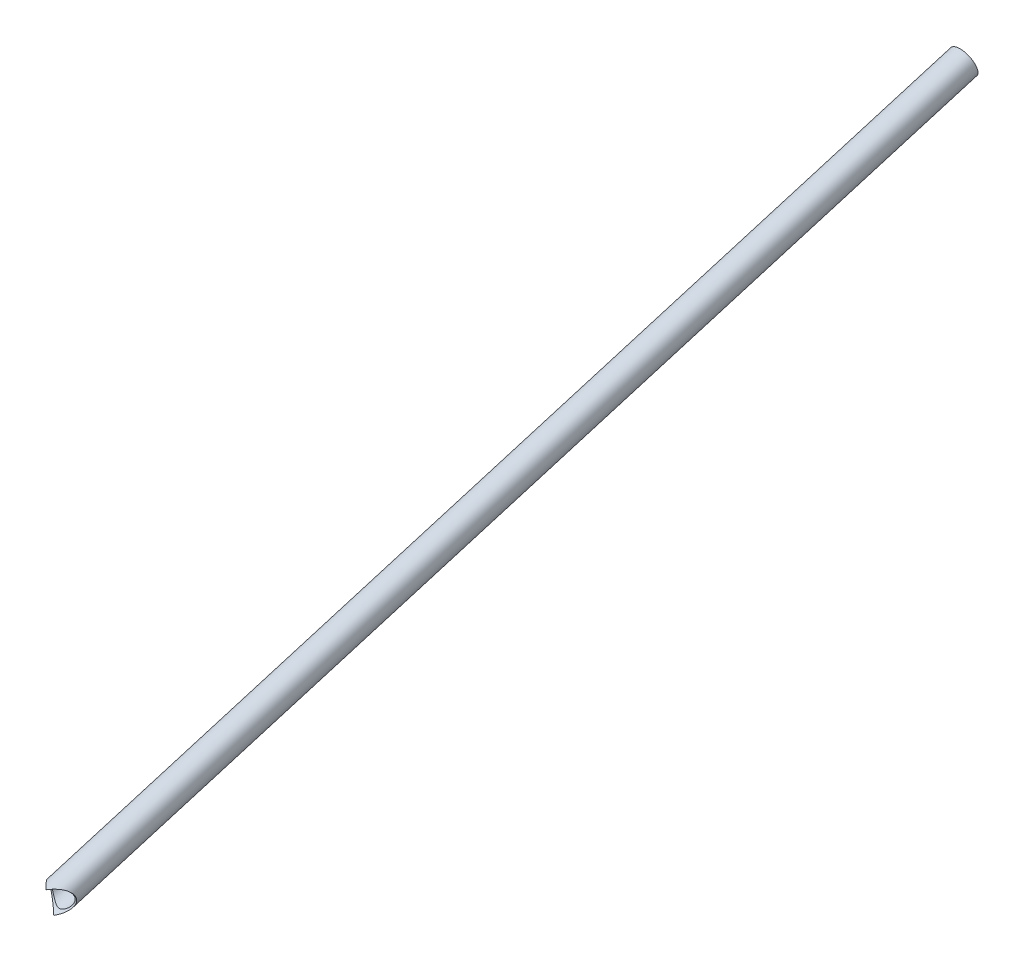
ISO-10303-21;
HEADER;
FILE_DESCRIPTION(('STEP AP214'),'2;1');
FILE_NAME('part.step','',(''),(''),'','','');
FILE_SCHEMA(('AUTOMOTIVE_DESIGN { 1 0 10303 214 1 1 1 1 }'));
ENDSEC;
DATA;
#1=APPLICATION_CONTEXT('core data for automotive mechanical design processes');
#2=APPLICATION_PROTOCOL_DEFINITION('international standard','automotive_design',2000,#1);
#3=PRODUCT_CONTEXT('',#1,'mechanical');
#4=PRODUCT('Part','Part','',(#3));
#5=PRODUCT_RELATED_PRODUCT_CATEGORY('part','',(#4));
#6=PRODUCT_DEFINITION_FORMATION('','',#4);
#7=PRODUCT_DEFINITION_CONTEXT('part definition',#1,'design');
#8=PRODUCT_DEFINITION('design','',#6,#7);
#9=PRODUCT_DEFINITION_SHAPE('','',#8);
#10=(LENGTH_UNIT() NAMED_UNIT(*) SI_UNIT(.MILLI.,.METRE.));
#11=(NAMED_UNIT(*) PLANE_ANGLE_UNIT() SI_UNIT($,.RADIAN.));
#12=(NAMED_UNIT(*) SI_UNIT($,.STERADIAN.) SOLID_ANGLE_UNIT());
#13=UNCERTAINTY_MEASURE_WITH_UNIT(LENGTH_MEASURE(1.E-05),#10,'distance_accuracy_value','');
#14=(GEOMETRIC_REPRESENTATION_CONTEXT(3) GLOBAL_UNCERTAINTY_ASSIGNED_CONTEXT((#13)) GLOBAL_UNIT_ASSIGNED_CONTEXT((#10,
#11,#12)) REPRESENTATION_CONTEXT('',''));
#15=CARTESIAN_POINT('',(0.,0.,0.));
#16=DIRECTION('',(0.,0.,1.));
#17=DIRECTION('',(1.,0.,0.));
#18=AXIS2_PLACEMENT_3D('',#15,#16,#17);
#19=CARTESIAN_POINT('',(0.,380.,-601.037933611912));
#20=DIRECTION('',(0.,0.28459115578957,-0.958648983750756));
#21=DIRECTION('',(0.,0.958648983750756,0.28459115578957));
#22=AXIS2_PLACEMENT_3D('',#19,#20,#21);
#23=CYLINDRICAL_SURFACE('',#22,7.1);
#24=CARTESIAN_POINT('',(0.,540.,-1140.));
#25=DIRECTION('',(0.,-0.28459115578957,0.958648983750756));
#26=DIRECTION('',(1.,0.,0.));
#27=AXIS2_PLACEMENT_3D('',#24,#25,#26);
#28=CIRCLE('',#27,7.1);
#29=CARTESIAN_POINT('',(7.10000000000003,540.,-1140.));
#30=VERTEX_POINT('',#29);
#31=EDGE_CURVE('E80',#30,#30,#28,.T.);
#32=ORIENTED_EDGE('',*,*,#31,.F.);
#33=EDGE_LOOP('',(#32));
#34=FACE_BOUND('',#33,.T.);
#35=CARTESIAN_POINT('',(0.,387.855542185796,-602.551359185627));
#36=CARTESIAN_POINT('',(-0.110485620792703,387.855542317616,-602.551342715054));
#37=CARTESIAN_POINT('',(-0.220930181131704,387.854484044348,-602.556880471244));
#38=CARTESIAN_POINT('',(-0.440730317581879,387.850246816259,-602.578631936881));
#39=CARTESIAN_POINT('',(-0.550085636184376,387.847067371506,-602.594848112741));
#40=CARTESIAN_POINT('',(-0.875646673448135,387.834286031328,-602.658385555484));
#41=CARTESIAN_POINT('',(-1.08890094621369,387.821440927512,-602.720590203443));
#42=CARTESIAN_POINT('',(-1.44749970977954,387.79147344696,-602.853475831368));
#43=CARTESIAN_POINT('',(-1.59570708238279,387.776424810418,-602.917399216428));
#44=CARTESIAN_POINT('',(-1.88591232098944,387.741330075925,-603.057093832454));
#45=CARTESIAN_POINT('',(-2.02790629122461,387.721280893975,-603.132872364084));
#46=CARTESIAN_POINT('',(-2.3063215746265,387.675895040551,-603.293509000797));
#47=CARTESIAN_POINT('',(-2.44272361123104,387.65054166234,-603.378395371336));
#48=CARTESIAN_POINT('',(-2.70995502785382,387.594348032313,-603.554769269548));
#49=CARTESIAN_POINT('',(-2.84078498422572,387.563508349693,-603.646256111845));
#50=CARTESIAN_POINT('',(-3.18030693594183,387.474277621893,-603.894874267166));
#51=CARTESIAN_POINT('',(-3.38465138088185,387.410964899638,-604.056204737491));
#52=CARTESIAN_POINT('',(-3.7807827612832,387.267583508657,-604.386782457685));
#53=CARTESIAN_POINT('',(-3.97256228406376,387.187505063793,-604.556034281609));
#54=CARTESIAN_POINT('',(-4.34355894800123,387.009535293983,-604.898453755151));
#55=CARTESIAN_POINT('',(-4.52278974960601,386.911663769586,-605.071616866463));
#56=CARTESIAN_POINT('',(-4.86836353818391,386.696917445559,-605.418911213122));
#57=CARTESIAN_POINT('',(-5.03471257312354,386.580051644556,-605.593041952505));
#58=CARTESIAN_POINT('',(-5.31565195123031,386.356266494638,-605.898463766426));
#59=CARTESIAN_POINT('',(-5.43317401386821,386.253539680852,-606.0301396551));
#60=CARTESIAN_POINT('',(-5.65930806686738,386.035898061858,-606.291200713811));
#61=CARTESIAN_POINT('',(-5.76791739975328,385.920979644774,-606.420585191675));
#62=CARTESIAN_POINT('',(-5.97505037371904,385.678832956545,-606.67546114425));
#63=CARTESIAN_POINT('',(-6.07358720637346,385.5516212218,-606.80095755682));
#64=CARTESIAN_POINT('',(-6.25951346138325,385.284693657772,-607.046667389016));
#65=CARTESIAN_POINT('',(-6.34691008740946,385.144986009306,-607.166884189327));
#66=CARTESIAN_POINT('',(-6.49376430822458,384.881079001717,-607.378116677627));
#67=CARTESIAN_POINT('',(-6.55536881124843,384.759022071887,-607.470320684725));
#68=CARTESIAN_POINT('',(-6.66970829112585,384.507090030579,-607.649287050107));
#69=CARTESIAN_POINT('',(-6.72244760458883,384.377218784122,-607.736052055901));
#70=CARTESIAN_POINT('',(-6.81834845273746,384.110075110791,-607.903216007868));
#71=CARTESIAN_POINT('',(-6.86151189509677,383.972804164846,-607.983616219959));
#72=CARTESIAN_POINT('',(-6.93759454247488,383.691492531093,-608.137127512992));
#73=CARTESIAN_POINT('',(-6.97051363542921,383.547451769249,-608.210238514192));
#74=CARTESIAN_POINT('',(-7.02568643013259,383.252648052774,-608.348675461792));
#75=CARTESIAN_POINT('',(-7.04787811025216,383.101851388237,-608.413954533596));
#76=CARTESIAN_POINT('',(-7.0808886859112,382.795429287702,-608.535448941881));
#77=CARTESIAN_POINT('',(-7.0917075547437,382.639803840366,-608.591664257076));
#78=CARTESIAN_POINT('',(-7.10175407465213,382.32505419249,-608.694402989015));
#79=CARTESIAN_POINT('',(-7.10098414994579,382.165930730642,-608.740928430684));
#80=CARTESIAN_POINT('',(-7.08787383787588,381.845556628091,-608.823901610938));
#81=CARTESIAN_POINT('',(-7.07553414696868,381.684306116005,-608.860349955955));
#82=CARTESIAN_POINT('',(-7.04118125841057,381.375871372923,-608.920151545827));
#83=CARTESIAN_POINT('',(-7.02015475166729,381.22874785024,-608.944396896602));
#84=CARTESIAN_POINT('',(-6.9690812008653,380.934880293781,-608.984505155226));
#85=CARTESIAN_POINT('',(-6.93903116829782,380.788136402,-609.000365281154));
#86=CARTESIAN_POINT('',(-6.87035627903503,380.496043362854,-609.02388375202));
#87=CARTESIAN_POINT('',(-6.83173325348934,380.350693924547,-609.031543846414));
#88=CARTESIAN_POINT('',(-6.74642204675732,380.062156305373,-609.038996075293));
#89=CARTESIAN_POINT('',(-6.69973083245801,379.918968959405,-609.038785244391));
#90=CARTESIAN_POINT('',(-6.54215875509565,379.476317946461,-609.026437248534));
#91=CARTESIAN_POINT('',(-6.41803816427477,379.181777596562,-609.001183517596));
#92=CARTESIAN_POINT('',(-6.14128171570964,378.610895480989,-608.921693138434));
#93=CARTESIAN_POINT('',(-5.98864000752405,378.334557464857,-608.867450539566));
#94=CARTESIAN_POINT('',(-5.69875329319272,377.866283699542,-608.750960119574));
#95=CARTESIAN_POINT('',(-5.56651729731407,377.669935515668,-608.693706111614));
#96=CARTESIAN_POINT('',(-5.28972669700386,377.290054599865,-608.567624567918));
#97=CARTESIAN_POINT('',(-5.14517092728355,377.106523083218,-608.498795936774));
#98=CARTESIAN_POINT('',(-4.84425460887032,376.752040081721,-608.351466514885));
#99=CARTESIAN_POINT('',(-4.68784357114033,376.581149323239,-608.272923339096));
#100=CARTESIAN_POINT('',(-4.36454792234121,376.253369792001,-608.108742838319));
#101=CARTESIAN_POINT('',(-4.19766585028594,376.096477647041,-608.023107231503));
#102=CARTESIAN_POINT('',(-3.84951873909499,375.793673361451,-607.84516244667));
#103=CARTESIAN_POINT('',(-3.66800627700812,375.648110377014,-607.752743091558));
#104=CARTESIAN_POINT('',(-3.2936544665083,375.373092403731,-607.566280875169));
#105=CARTESIAN_POINT('',(-3.10080639505445,375.243650065465,-607.472236803986));
#106=CARTESIAN_POINT('',(-2.70385591450434,375.003362160252,-607.287448079555));
#107=CARTESIAN_POINT('',(-2.49981785400239,374.892422595584,-607.196688705517));
#108=CARTESIAN_POINT('',(-2.07826995408303,374.691506465331,-607.024361369682));
#109=CARTESIAN_POINT('',(-1.86078676501185,374.60149001313,-606.942776074873));
#110=CARTESIAN_POINT('',(-1.44469049273549,374.45907561317,-606.809092353444));
#111=CARTESIAN_POINT('',(-1.24823142177244,374.403039927822,-606.754397114056));
#112=CARTESIAN_POINT('',(-0.946501118045702,374.336453225679,-606.688174241416));
#113=CARTESIAN_POINT('',(-0.844864802201651,374.317180271164,-606.668749144691));
#114=CARTESIAN_POINT('',(-0.639636928537908,374.284974495279,-606.636059438254));
#115=CARTESIAN_POINT('',(-0.536046408136761,374.272038403076,-606.622791650573));
#116=CARTESIAN_POINT('',(-0.326403848629083,374.252852575646,-606.603047459473));
#117=CARTESIAN_POINT('',(-0.220337227957515,374.246679707431,-606.596649146736));
#118=CARTESIAN_POINT('',(-0.00784340408138928,374.241535782055,-606.591320372529));
#119=CARTESIAN_POINT('',(0.0985837763314269,374.242564277869,-606.592389447519));
#120=CARTESIAN_POINT('',(0.31090005011121,374.251783742491,-606.601929670327));
#121=CARTESIAN_POINT('',(0.416788444963208,374.259982382507,-606.610408745963));
#122=CARTESIAN_POINT('',(0.627065564376763,374.283226712856,-606.634251707206));
#123=CARTESIAN_POINT('',(0.731453361635332,374.298276463815,-606.64961967575));
#124=CARTESIAN_POINT('',(0.960818791009505,374.338724007888,-606.690450737136));
#125=CARTESIAN_POINT('',(1.08525739981042,374.365672363705,-606.717393094995));
#126=CARTESIAN_POINT('',(1.33027120339504,374.427921087544,-606.778476417004));
#127=CARTESIAN_POINT('',(1.45084285494883,374.463228880162,-606.812623777466));
#128=CARTESIAN_POINT('',(1.68822080540147,374.5412637964,-606.886445186714));
#129=CARTESIAN_POINT('',(1.8050146253731,374.584013017048,-606.926135624013));
#130=CARTESIAN_POINT('',(2.0345187118196,374.675974239674,-607.009416514863));
#131=CARTESIAN_POINT('',(2.14722997266292,374.725184654242,-607.053006009641));
#132=CARTESIAN_POINT('',(2.45884513879425,374.871702967749,-607.179271229312));
#133=CARTESIAN_POINT('',(2.65343542887949,374.975623851536,-607.264948904169));
#134=CARTESIAN_POINT('',(3.03162098900903,375.199742493272,-607.439321768112));
#135=CARTESIAN_POINT('',(3.21520777151252,375.319952588646,-607.528019205861));
#136=CARTESIAN_POINT('',(3.5725482566155,375.575253644851,-607.704699105753));
#137=CARTESIAN_POINT('',(3.74628709000422,375.710366245818,-607.792680323533));
#138=CARTESIAN_POINT('',(4.08401061829514,375.994354291655,-607.964865840922));
#139=CARTESIAN_POINT('',(4.2479980021967,376.143225913227,-608.049071180154));
#140=CARTESIAN_POINT('',(4.57702595270552,376.464770403975,-608.216877943238));
#141=CARTESIAN_POINT('',(4.74138013277422,376.638373329626,-608.300049091209));
#142=CARTESIAN_POINT('',(5.05830759973461,377.000174700485,-608.456823849088));
#143=CARTESIAN_POINT('',(5.21087821677361,377.18837643416,-608.530425293313));
#144=CARTESIAN_POINT('',(5.50260263115188,377.578272736036,-608.66536386595));
#145=CARTESIAN_POINT('',(5.6417900320534,377.779931235697,-608.726732149895));
#146=CARTESIAN_POINT('',(5.90543643043999,378.196323874287,-608.834918137984));
#147=CARTESIAN_POINT('',(6.02990318954046,378.411051031349,-608.881743531391));
#148=CARTESIAN_POINT('',(6.22499359662197,378.7819957527,-608.946142185799));
#149=CARTESIAN_POINT('',(6.30013884339852,378.935062389633,-608.968282149455));
#150=CARTESIAN_POINT('',(6.44182086448468,379.246095901763,-609.003868125677));
#151=CARTESIAN_POINT('',(6.50835999979093,379.404061418196,-609.017316526747));
#152=CARTESIAN_POINT('',(6.63201232801828,379.724147598484,-609.034782433145));
#153=CARTESIAN_POINT('',(6.68912655161454,379.886267805752,-609.038800970327));
#154=CARTESIAN_POINT('',(6.7930797085635,380.213642663674,-609.036754310162));
#155=CARTESIAN_POINT('',(6.83992364999067,380.378895743748,-609.030694039956));
#156=CARTESIAN_POINT('',(6.92291834717186,380.71278377831,-609.007887161796));
#157=CARTESIAN_POINT('',(6.95897969358977,380.881435266463,-608.991054650012));
#158=CARTESIAN_POINT('',(7.01920550870409,381.219405154358,-608.946290106702));
#159=CARTESIAN_POINT('',(7.04336998520591,381.388723553664,-608.918358082458));
#160=CARTESIAN_POINT('',(7.07928977421749,381.726385254401,-608.851332676856));
#161=CARTESIAN_POINT('',(7.09105128615228,381.89472900111,-608.812244883957));
#162=CARTESIAN_POINT('',(7.10192643884897,382.228896568558,-608.723108494428));
#163=CARTESIAN_POINT('',(7.10104139829143,382.394720650222,-608.673061041118));
#164=CARTESIAN_POINT('',(7.0874945449373,382.703074184941,-608.568982153546));
#165=CARTESIAN_POINT('',(7.07622396264459,382.846057546551,-608.516103559782));
#166=CARTESIAN_POINT('',(7.0440354379204,383.127887703787,-608.402673693628));
#167=CARTESIAN_POINT('',(7.02311432999617,383.266733126196,-608.342119908411));
#168=CARTESIAN_POINT('',(6.97197129627461,383.53931500034,-608.213999692544));
#169=CARTESIAN_POINT('',(6.94175240141209,383.673053101035,-608.146435551913));
#170=CARTESIAN_POINT('',(6.87245678520206,383.934805531684,-608.004959620512));
#171=CARTESIAN_POINT('',(6.83337668284994,384.062817654504,-607.93104541357));
#172=CARTESIAN_POINT('',(6.74627417017546,384.314324855616,-607.776530715094));
#173=CARTESIAN_POINT('',(6.69813104582587,384.437728293026,-607.695849239669));
#174=CARTESIAN_POINT('',(6.59388601367744,384.677663677983,-607.529528592492));
#175=CARTESIAN_POINT('',(6.53778105505786,384.794192967147,-607.443887527801));
#176=CARTESIAN_POINT('',(6.35843168021676,385.133054456236,-607.180687291705));
#177=CARTESIAN_POINT('',(6.22411197441847,385.344775483685,-606.996779239817));
#178=CARTESIAN_POINT('',(5.96872899230306,385.688020367173,-606.667111743927));
#179=CARTESIAN_POINT('',(5.85318979731102,385.826140340987,-606.523755040038));
#180=CARTESIAN_POINT('',(5.61005159145393,386.086755416387,-606.233072565076));
#181=CARTESIAN_POINT('',(5.48245161513596,386.209249265271,-606.085746476933));
#182=CARTESIAN_POINT('',(5.21615915580871,386.439381693399,-605.788698970023));
#183=CARTESIAN_POINT('',(5.07743922199982,386.546981603155,-605.638972401996));
#184=CARTESIAN_POINT('',(4.79013520727759,386.747632630394,-605.339323276307));
#185=CARTESIAN_POINT('',(4.6415525851818,386.84068589271,-605.18940075083));
#186=CARTESIAN_POINT('',(4.3317468302415,387.014858648563,-604.887960022965));
#187=CARTESIAN_POINT('',(4.17031975175545,387.095676358828,-604.736477485221));
#188=CARTESIAN_POINT('',(3.83784499837152,387.243731917306,-604.437373275505));
#189=CARTESIAN_POINT('',(3.66679436984548,387.310965566954,-604.289752809457));
#190=CARTESIAN_POINT('',(3.31504602295272,387.432527407265,-604.001371049785));
#191=CARTESIAN_POINT('',(3.13436299923229,387.48687460365,-603.860599901192));
#192=CARTESIAN_POINT('',(2.76236446767384,387.583534658457,-603.589536082907));
#193=CARTESIAN_POINT('',(2.57105680113579,387.625856254662,-603.459235854688));
#194=CARTESIAN_POINT('',(2.16419859873808,387.701532142425,-603.206971063427));
#195=CARTESIAN_POINT('',(1.94788073387941,387.734175542923,-603.086010821918));
#196=CARTESIAN_POINT('',(1.50036409429858,387.787589874288,-602.87248413651));
#197=CARTESIAN_POINT('',(1.26920866824131,387.808393782111,-602.779839162101));
#198=CARTESIAN_POINT('',(0.864201083744588,387.834343310088,-602.658348998951));
#199=CARTESIAN_POINT('',(0.693825385172043,387.842308651797,-602.618716030412));
#200=CARTESIAN_POINT('',(0.348928232704867,387.852904236745,-602.565252253529));
#201=CARTESIAN_POINT('',(0.174412955271756,387.855541977705,-602.551385186125));
#202=CARTESIAN_POINT('',(0.,387.855542185796,-602.551359185627));
#203=B_SPLINE_CURVE_WITH_KNOTS('',3,(#35,#36,#37,#38,#39,#40,#41,#42,#43,#44,#45,#46,#47,#48,
#49,#50,#51,#52,#53,#54,#55,#56,#57,#58,#59,#60,#61,#62,#63,#64,#65,#66,#67,#68,#69,#70,#71,#72,
#73,#74,#75,#76,#77,#78,#79,#80,#81,#82,#83,#84,#85,#86,#87,#88,#89,#90,#91,#92,#93,#94,#95,#96,
#97,#98,#99,#100,#101,#102,#103,#104,#105,#106,#107,#108,#109,#110,#111,#112,#113,#114,#115,
#116,#117,#118,#119,#120,#121,#122,#123,#124,#125,#126,#127,#128,#129,#130,#131,#132,#133,#134,
#135,#136,#137,#138,#139,#140,#141,#142,#143,#144,#145,#146,#147,#148,#149,#150,#151,#152,#153,
#154,#155,#156,#157,#158,#159,#160,#161,#162,#163,#164,#165,#166,#167,#168,#169,#170,#171,#172,
#173,#174,#175,#176,#177,#178,#179,#180,#181,#182,#183,#184,#185,#186,#187,#188,#189,#190,#191,
#192,#193,#194,#195,#196,#197,#198,#199,#200,#201,#202),.UNSPECIFIED.,.T.,.F.,(4,2,2,2,2,2,2,2,
2,2,2,2,2,2,2,2,2,2,2,2,2,2,2,2,2,2,2,2,2,2,2,2,2,2,2,2,2,2,2,2,2,2,2,2,2,2,2,2,2,2,2,2,2,2,2,2,
2,2,2,2,2,2,2,2,2,2,2,2,2,2,2,2,2,2,2,2,2,2,2,2,2,2,2,4),(0.,0.331238834662174,0.6625542028966,
1.32650237358194,1.81222443079444,2.29824679258448,2.78582367913436,3.27335000959083,
4.07608013699982,4.87927964862389,5.68159075241183,6.48352285955302,7.09565119288438,
7.70796138405016,8.31945909491074,8.93055936078482,9.42481306159152,9.9188242788763,
10.4127369923157,10.9066551085508,11.4033956868334,11.9001374316178,12.3967752662403,
12.8933832070536,13.3446241998957,13.7960148047431,14.2473090873715,14.6987733978041,
15.6568055305911,16.6150343974735,17.3447503841808,18.0745354692008,18.8076250762666,
19.5405376058019,20.2908521998315,21.0417519374526,21.7887123950699,22.5342369927857,
23.1664807314281,23.4819189029992,23.7971940860954,24.1160164887669,24.4348191006452,
24.7539632114627,25.0732967245523,25.4630899485942,25.8532306824515,26.2445503272248,
26.6357740103965,27.3446169804018,28.0539998594811,28.7644267535032,29.4746568273643,
30.2331733637369,30.9918612593477,31.7485915156075,32.504920982006,33.0203225413027,
33.5355824043003,34.0507858828994,34.5657375724538,35.0848478285157,35.6039577439943,
36.1228080674567,36.6416042897842,37.0996479837371,37.5578420286879,38.0158868674298,
38.4741067687113,38.9389278763518,39.4039275777988,40.3335056618965,41.0231965006818,
41.7129425953291,42.4044471875586,43.0958497243696,43.8022125070796,44.5087932796843,
45.2143253703839,45.9193435039699,46.6676869675469,47.4139357118647,47.937567839364,
48.4604625259278),.UNSPECIFIED.);
#204=CARTESIAN_POINT('',(0.,387.855542185796,-602.551359185627));
#205=VERTEX_POINT('',#204);
#206=EDGE_CURVE('E83',#205,#205,#203,.T.);
#207=ORIENTED_EDGE('',*,*,#206,.T.);
#208=EDGE_LOOP('',(#207));
#209=FACE_BOUND('',#208,.T.);
#210=ADVANCED_FACE('F41',(#34,#209),#23,.F.);
#211=CARTESIAN_POINT('',(0.,540.,-1140.));
#212=DIRECTION('',(0.,-0.28459115578957,0.958648983750756));
#213=DIRECTION('',(1.,0.,0.));
#214=AXIS2_PLACEMENT_3D('',#211,#212,#213);
#215=PLANE('',#214);
#216=ORIENTED_EDGE('',*,*,#31,.T.);
#217=EDGE_LOOP('',(#216));
#218=FACE_BOUND('',#217,.T.);
#219=CARTESIAN_POINT('',(0.,540.,-1140.));
#220=DIRECTION('',(0.,-0.28459115578957,0.958648983750756));
#221=DIRECTION('',(1.,0.,0.));
#222=AXIS2_PLACEMENT_3D('',#219,#220,#221);
#223=CIRCLE('',#222,8.);
#224=CARTESIAN_POINT('',(8.00000000000003,540.,-1140.));
#225=VERTEX_POINT('',#224);
#226=EDGE_CURVE('E57',#225,#225,#223,.T.);
#227=ORIENTED_EDGE('',*,*,#226,.F.);
#228=EDGE_LOOP('',(#227));
#229=FACE_BOUND('',#228,.T.);
#230=ADVANCED_FACE('F60',(#218,#229),#215,.F.);
#231=CARTESIAN_POINT('',(0.,380.,-601.037933611912));
#232=DIRECTION('',(0.,0.28459115578957,-0.958648983750756));
#233=DIRECTION('',(0.,0.958648983750756,0.28459115578957));
#234=AXIS2_PLACEMENT_3D('',#231,#232,#233);
#235=CYLINDRICAL_SURFACE('',#234,8.);
#236=ORIENTED_EDGE('',*,*,#226,.T.);
#237=EDGE_LOOP('',(#236));
#238=FACE_BOUND('',#237,.T.);
#239=CARTESIAN_POINT('',(0.,380.,-601.037933611912));
#240=DIRECTION('',(-0.707106781186547,0.201236336124522,-0.677867197187752));
#241=DIRECTION('',(0.707106781186547,0.201236336124522,-0.677867197187752));
#242=AXIS2_PLACEMENT_3D('',#239,#240,#241);
#243=ELLIPSE('',#242,11.3137084989848,8.);
#244=CARTESIAN_POINT('',(0.,372.330808129994,-603.314662858229));
#245=VERTEX_POINT('',#244);
#246=CARTESIAN_POINT('',(0.,387.669191870006,-598.761204365596));
#247=VERTEX_POINT('',#246);
#248=EDGE_CURVE('E11',#245,#247,#243,.F.);
#249=ORIENTED_EDGE('',*,*,#248,.F.);
#250=CARTESIAN_POINT('',(0.,380.,-601.037933611912));
#251=DIRECTION('',(0.707106781186547,0.201236336124522,-0.677867197187752));
#252=DIRECTION('',(-0.707106781186547,0.201236336124522,-0.677867197187752));
#253=AXIS2_PLACEMENT_3D('',#250,#251,#252);
#254=ELLIPSE('',#253,11.3137084989848,8.);
#255=EDGE_CURVE('E49',#247,#245,#254,.F.);
#256=ORIENTED_EDGE('',*,*,#255,.F.);
#257=EDGE_LOOP('',(#249,#256));
#258=FACE_BOUND('',#257,.T.);
#259=ADVANCED_FACE('F58',(#238,#258),#235,.T.);
#260=CARTESIAN_POINT('',(80.,380.,-601.037933611912));
#261=DIRECTION('',(-1.,0.,0.));
#262=DIRECTION('',(0.,0.,1.));
#263=AXIS2_PLACEMENT_3D('',#260,#261,#262);
#264=CYLINDRICAL_SURFACE('',#263,8.);
#265=ORIENTED_EDGE('',*,*,#206,.F.);
#266=EDGE_LOOP('',(#265));
#267=FACE_BOUND('',#266,.T.);
#268=ORIENTED_EDGE('',*,*,#248,.T.);
#269=ORIENTED_EDGE('',*,*,#255,.T.);
#270=EDGE_LOOP('',(#268,#269));
#271=FACE_BOUND('',#270,.T.);
#272=ADVANCED_FACE('F55',(#267,#271),#264,.F.);
#273=CLOSED_SHELL('',(#210,#230,#259,#272));
#274=MANIFOLD_SOLID_BREP('B2',#273);
#275=ADVANCED_BREP_SHAPE_REPRESENTATION('',(#18,#274),#14);
#276=SHAPE_DEFINITION_REPRESENTATION(#9,#275);
ENDSEC;
END-ISO-10303-21;
